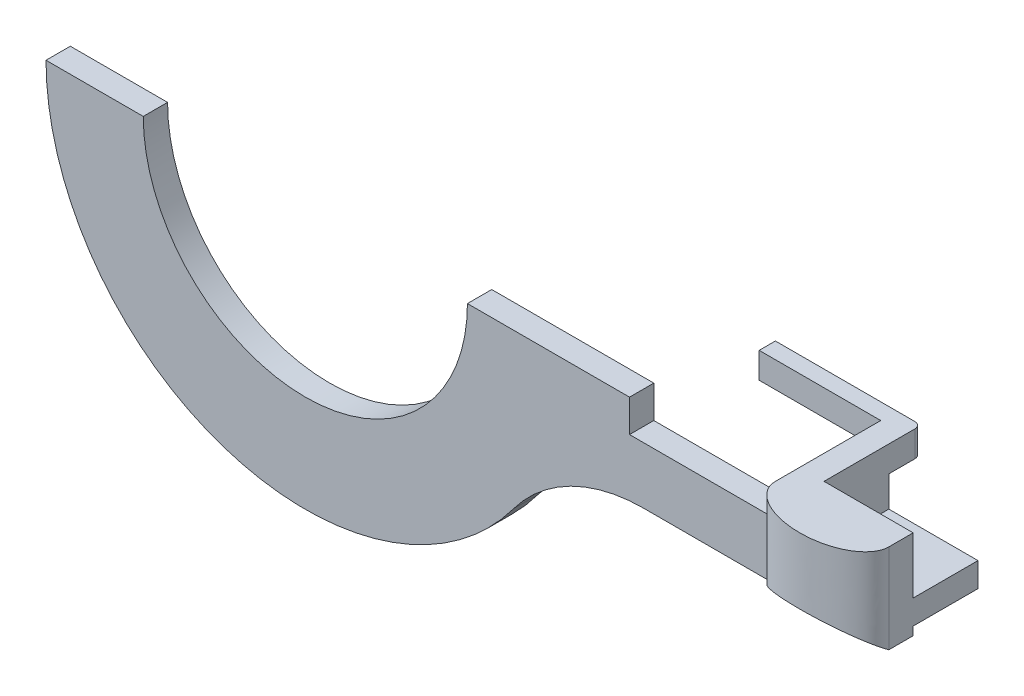
ISO-10303-21;
HEADER;
FILE_DESCRIPTION(('STEP AP214'),'2;1');
FILE_NAME('part.step','',(''),(''),'','','');
FILE_SCHEMA(('AUTOMOTIVE_DESIGN { 1 0 10303 214 1 1 1 1 }'));
ENDSEC;
DATA;
#1=APPLICATION_CONTEXT('core data for automotive mechanical design processes');
#2=APPLICATION_PROTOCOL_DEFINITION('international standard','automotive_design',2000,#1);
#3=PRODUCT_CONTEXT('',#1,'mechanical');
#4=PRODUCT('Part','Part','',(#3));
#5=PRODUCT_RELATED_PRODUCT_CATEGORY('part','',(#4));
#6=PRODUCT_DEFINITION_FORMATION('','',#4);
#7=PRODUCT_DEFINITION_CONTEXT('part definition',#1,'design');
#8=PRODUCT_DEFINITION('design','',#6,#7);
#9=PRODUCT_DEFINITION_SHAPE('','',#8);
#10=(LENGTH_UNIT() NAMED_UNIT(*) SI_UNIT(.MILLI.,.METRE.));
#11=(NAMED_UNIT(*) PLANE_ANGLE_UNIT() SI_UNIT($,.RADIAN.));
#12=(NAMED_UNIT(*) SI_UNIT($,.STERADIAN.) SOLID_ANGLE_UNIT());
#13=UNCERTAINTY_MEASURE_WITH_UNIT(LENGTH_MEASURE(1.E-05),#10,'distance_accuracy_value','');
#14=(GEOMETRIC_REPRESENTATION_CONTEXT(3) GLOBAL_UNCERTAINTY_ASSIGNED_CONTEXT((#13)) GLOBAL_UNIT_ASSIGNED_CONTEXT((#10,
#11,#12)) REPRESENTATION_CONTEXT('',''));
#15=CARTESIAN_POINT('',(0.,0.,0.));
#16=DIRECTION('',(0.,0.,1.));
#17=DIRECTION('',(1.,0.,0.));
#18=AXIS2_PLACEMENT_3D('',#15,#16,#17);
#19=CARTESIAN_POINT('',(14.5,2.50874087860968,-2.));
#20=DIRECTION('',(0.,0.,1.));
#21=DIRECTION('',(1.,0.,0.));
#22=AXIS2_PLACEMENT_3D('',#19,#20,#21);
#23=PLANE('',#22);
#24=DIRECTION('',(-1.,0.,0.));
#25=VECTOR('',#24,1.);
#26=CARTESIAN_POINT('',(15.25,-0.8,-2.));
#27=LINE('',#26,#25);
#28=CARTESIAN_POINT('',(15.25,-0.8,-2.));
#29=VERTEX_POINT('',#28);
#30=CARTESIAN_POINT('',(14.5,-0.8,-2.));
#31=VERTEX_POINT('',#30);
#32=EDGE_CURVE('E224',#29,#31,#27,.T.);
#33=ORIENTED_EDGE('',*,*,#32,.F.);
#34=DIRECTION('',(0.,-1.,0.));
#35=VECTOR('',#34,1.);
#36=CARTESIAN_POINT('',(15.25,-1.74125912139032,-2.));
#37=LINE('',#36,#35);
#38=CARTESIAN_POINT('',(15.25,-1.74125912139032,-2.));
#39=VERTEX_POINT('',#38);
#40=EDGE_CURVE('E253',#29,#39,#37,.T.);
#41=ORIENTED_EDGE('',*,*,#40,.T.);
#42=DIRECTION('',(1.,0.,0.));
#43=VECTOR('',#42,1.);
#44=CARTESIAN_POINT('',(18.,-1.74125912139032,-2.));
#45=LINE('',#44,#43);
#46=CARTESIAN_POINT('',(18.,-1.74125912139032,-2.));
#47=VERTEX_POINT('',#46);
#48=EDGE_CURVE('E255',#39,#47,#45,.T.);
#49=ORIENTED_EDGE('',*,*,#48,.T.);
#50=DIRECTION('',(0.,-1.,0.));
#51=VECTOR('',#50,1.);
#52=CARTESIAN_POINT('',(18.,-2.49125912139032,-2.));
#53=LINE('',#52,#51);
#54=CARTESIAN_POINT('',(18.,-2.49125912139032,-2.));
#55=VERTEX_POINT('',#54);
#56=EDGE_CURVE('E259',#47,#55,#53,.T.);
#57=ORIENTED_EDGE('',*,*,#56,.T.);
#58=DIRECTION('',(-1.,0.,0.));
#59=VECTOR('',#58,1.);
#60=CARTESIAN_POINT('',(18.,-2.49125912139032,-2.));
#61=LINE('',#60,#59);
#62=CARTESIAN_POINT('',(14.5,-2.49125912139032,-2.));
#63=VERTEX_POINT('',#62);
#64=EDGE_CURVE('E261',#55,#63,#61,.T.);
#65=ORIENTED_EDGE('',*,*,#64,.T.);
#66=DIRECTION('',(0.,1.,0.));
#67=VECTOR('',#66,1.);
#68=CARTESIAN_POINT('',(14.5,-2.49125912139032,-2.));
#69=LINE('',#68,#67);
#70=EDGE_CURVE('E251',#63,#31,#69,.T.);
#71=ORIENTED_EDGE('',*,*,#70,.T.);
#72=EDGE_LOOP('',(#33,#41,#49,#57,#65,#71));
#73=FACE_BOUND('',#72,.T.);
#74=ADVANCED_FACE('F35',(#73),#23,.F.);
#75=CARTESIAN_POINT('',(10.4373128725741,7.75,0.));
#76=DIRECTION('',(0.,0.,1.));
#77=DIRECTION('',(1.,0.,0.));
#78=AXIS2_PLACEMENT_3D('',#75,#76,#77);
#79=PLANE('',#78);
#80=CARTESIAN_POINT('',(0.,0.,0.));
#81=DIRECTION('',(0.,0.,1.));
#82=DIRECTION('',(1.,0.,0.));
#83=AXIS2_PLACEMENT_3D('',#80,#81,#82);
#84=CIRCLE('',#83,8.);
#85=CARTESIAN_POINT('',(-8.,0.,0.));
#86=VERTEX_POINT('',#85);
#87=CARTESIAN_POINT('',(6.42296176773788,-4.76923076923077,0.));
#88=VERTEX_POINT('',#87);
#89=EDGE_CURVE('E349',#86,#88,#84,.T.);
#90=ORIENTED_EDGE('',*,*,#89,.F.);
#91=DIRECTION('',(1.,0.,0.));
#92=VECTOR('',#91,1.);
#93=CARTESIAN_POINT('',(10.4373128725741,0.,0.));
#94=LINE('',#93,#92);
#95=CARTESIAN_POINT('',(-5.,0.,0.));
#96=VERTEX_POINT('',#95);
#97=EDGE_CURVE('E398',#86,#96,#94,.T.);
#98=ORIENTED_EDGE('',*,*,#97,.T.);
#99=CARTESIAN_POINT('',(0.,0.,0.));
#100=DIRECTION('',(0.,0.,1.));
#101=DIRECTION('',(1.,0.,0.));
#102=AXIS2_PLACEMENT_3D('',#99,#100,#101);
#103=CIRCLE('',#102,5.);
#104=CARTESIAN_POINT('',(5.,0.,0.));
#105=VERTEX_POINT('',#104);
#106=EDGE_CURVE('E355',#96,#105,#103,.T.);
#107=ORIENTED_EDGE('',*,*,#106,.T.);
#108=CARTESIAN_POINT('',(10.,0.,0.));
#109=VERTEX_POINT('',#108);
#110=EDGE_CURVE('E389',#105,#109,#94,.T.);
#111=ORIENTED_EDGE('',*,*,#110,.T.);
#112=DIRECTION('',(0.,-1.,0.));
#113=VECTOR('',#112,1.);
#114=CARTESIAN_POINT('',(10.,1.,0.));
#115=LINE('',#114,#113);
#116=CARTESIAN_POINT('',(10.,-1.,0.));
#117=VERTEX_POINT('',#116);
#118=EDGE_CURVE('E290',#109,#117,#115,.T.);
#119=ORIENTED_EDGE('',*,*,#118,.T.);
#120=DIRECTION('',(1.,0.,0.));
#121=VECTOR('',#120,1.);
#122=CARTESIAN_POINT('',(10.,-1.,0.));
#123=LINE('',#122,#121);
#124=CARTESIAN_POINT('',(14.5,-1.,0.));
#125=VERTEX_POINT('',#124);
#126=EDGE_CURVE('E286',#117,#125,#123,.T.);
#127=ORIENTED_EDGE('',*,*,#126,.T.);
#128=DIRECTION('',(0.,1.,0.));
#129=VECTOR('',#128,1.);
#130=CARTESIAN_POINT('',(14.5,-2.49125912139032,0.));
#131=LINE('',#130,#129);
#132=CARTESIAN_POINT('',(14.5,-2.49125912139032,0.));
#133=VERTEX_POINT('',#132);
#134=EDGE_CURVE('E215',#133,#125,#131,.T.);
#135=ORIENTED_EDGE('',*,*,#134,.F.);
#136=DIRECTION('',(-1.,0.,0.));
#137=VECTOR('',#136,1.);
#138=CARTESIAN_POINT('',(18.,-2.49125912139032,0.));
#139=LINE('',#138,#137);
#140=CARTESIAN_POINT('',(18.,-2.49125912139032,0.));
#141=VERTEX_POINT('',#140);
#142=EDGE_CURVE('E241',#141,#133,#139,.T.);
#143=ORIENTED_EDGE('',*,*,#142,.F.);
#144=DIRECTION('',(0.,1.,0.));
#145=VECTOR('',#144,1.);
#146=CARTESIAN_POINT('',(18.,2.75,0.));
#147=LINE('',#146,#145);
#148=CARTESIAN_POINT('',(18.,-2.75,0.));
#149=VERTEX_POINT('',#148);
#150=EDGE_CURVE('E309',#149,#141,#147,.T.);
#151=ORIENTED_EDGE('',*,*,#150,.F.);
#152=DIRECTION('',(1.,0.,0.));
#153=VECTOR('',#152,1.);
#154=CARTESIAN_POINT('',(10.4373128725741,-2.75,0.));
#155=LINE('',#154,#153);
#156=CARTESIAN_POINT('',(10.4373128725741,-2.75,0.));
#157=VERTEX_POINT('',#156);
#158=EDGE_CURVE('E318',#157,#149,#155,.T.);
#159=ORIENTED_EDGE('',*,*,#158,.F.);
#160=CARTESIAN_POINT('',(10.4373128725741,-7.75,0.));
#161=DIRECTION('',(0.,0.,-1.));
#162=DIRECTION('',(-1.,0.,0.));
#163=AXIS2_PLACEMENT_3D('',#160,#161,#162);
#164=CIRCLE('',#163,5.);
#165=EDGE_CURVE('E343',#88,#157,#164,.T.);
#166=ORIENTED_EDGE('',*,*,#165,.F.);
#167=EDGE_LOOP('',(#90,#98,#107,#111,#119,#127,#135,#143,#151,#159,#166));
#168=FACE_BOUND('',#167,.T.);
#169=ADVANCED_FACE('F347',(#168),#79,.F.);
#170=DIRECTION('',(0.,-1.,0.));
#171=VECTOR('',#170,1.);
#172=CARTESIAN_POINT('',(15.25,-1.74125912139032,0.));
#173=LINE('',#172,#171);
#174=CARTESIAN_POINT('',(15.25,0.,0.));
#175=VERTEX_POINT('',#174);
#176=CARTESIAN_POINT('',(15.25,-1.74125912139032,0.));
#177=VERTEX_POINT('',#176);
#178=EDGE_CURVE('E230',#175,#177,#173,.T.);
#179=ORIENTED_EDGE('',*,*,#178,.F.);
#180=DIRECTION('',(1.,0.,0.));
#181=VECTOR('',#180,1.);
#182=CARTESIAN_POINT('',(10.4373128725741,0.,0.));
#183=LINE('',#182,#181);
#184=CARTESIAN_POINT('',(18.,0.,0.));
#185=VERTEX_POINT('',#184);
#186=EDGE_CURVE('E444',#175,#185,#183,.T.);
#187=ORIENTED_EDGE('',*,*,#186,.T.);
#188=CARTESIAN_POINT('',(18.,-1.74125912139032,0.));
#189=VERTEX_POINT('',#188);
#190=EDGE_CURVE('E277',#189,#185,#147,.T.);
#191=ORIENTED_EDGE('',*,*,#190,.F.);
#192=DIRECTION('',(1.,0.,0.));
#193=VECTOR('',#192,1.);
#194=CARTESIAN_POINT('',(18.,-1.74125912139032,0.));
#195=LINE('',#194,#193);
#196=EDGE_CURVE('E232',#177,#189,#195,.T.);
#197=ORIENTED_EDGE('',*,*,#196,.F.);
#198=EDGE_LOOP('',(#179,#187,#191,#197));
#199=FACE_BOUND('',#198,.T.);
#200=ADVANCED_FACE('F468',(#199),#79,.F.);
#201=CARTESIAN_POINT('',(10.4373128725741,7.75,0.75));
#202=DIRECTION('',(0.,0.,1.));
#203=DIRECTION('',(1.,0.,0.));
#204=AXIS2_PLACEMENT_3D('',#201,#202,#203);
#205=PLANE('',#204);
#206=DIRECTION('',(1.,0.,0.));
#207=VECTOR('',#206,1.);
#208=CARTESIAN_POINT('',(10.4373128725741,0.,0.75));
#209=LINE('',#208,#207);
#210=CARTESIAN_POINT('',(-8.,0.,0.75));
#211=VERTEX_POINT('',#210);
#212=CARTESIAN_POINT('',(-5.,0.,0.75));
#213=VERTEX_POINT('',#212);
#214=EDGE_CURVE('E50',#211,#213,#209,.T.);
#215=ORIENTED_EDGE('',*,*,#214,.F.);
#216=CARTESIAN_POINT('',(0.,0.,0.75));
#217=DIRECTION('',(0.,0.,1.));
#218=DIRECTION('',(1.,0.,0.));
#219=AXIS2_PLACEMENT_3D('',#216,#217,#218);
#220=CIRCLE('',#219,8.);
#221=CARTESIAN_POINT('',(6.42296176773788,-4.76923076923077,0.75));
#222=VERTEX_POINT('',#221);
#223=EDGE_CURVE('E315',#211,#222,#220,.T.);
#224=ORIENTED_EDGE('',*,*,#223,.T.);
#225=CARTESIAN_POINT('',(10.4373128725741,-7.75,0.75));
#226=DIRECTION('',(0.,0.,-1.));
#227=DIRECTION('',(-1.,0.,0.));
#228=AXIS2_PLACEMENT_3D('',#225,#226,#227);
#229=CIRCLE('',#228,5.);
#230=CARTESIAN_POINT('',(10.4373128725741,-2.75,0.75));
#231=VERTEX_POINT('',#230);
#232=EDGE_CURVE('E316',#222,#231,#229,.T.);
#233=ORIENTED_EDGE('',*,*,#232,.T.);
#234=DIRECTION('',(1.,0.,0.));
#235=VECTOR('',#234,1.);
#236=CARTESIAN_POINT('',(10.4373128725741,-2.75,0.75));
#237=LINE('',#236,#235);
#238=CARTESIAN_POINT('',(14.5,-2.75,0.75));
#239=VERTEX_POINT('',#238);
#240=EDGE_CURVE('E327',#231,#239,#237,.T.);
#241=ORIENTED_EDGE('',*,*,#240,.T.);
#242=DIRECTION('',(0.,1.,0.));
#243=VECTOR('',#242,1.);
#244=CARTESIAN_POINT('',(14.5,-2.75,0.75));
#245=LINE('',#244,#243);
#246=CARTESIAN_POINT('',(14.5,-1.,0.75));
#247=VERTEX_POINT('',#246);
#248=EDGE_CURVE('E268',#239,#247,#245,.T.);
#249=ORIENTED_EDGE('',*,*,#248,.T.);
#250=DIRECTION('',(1.,0.,0.));
#251=VECTOR('',#250,1.);
#252=CARTESIAN_POINT('',(10.,-1.,0.75));
#253=LINE('',#252,#251);
#254=CARTESIAN_POINT('',(10.,-1.,0.75));
#255=VERTEX_POINT('',#254);
#256=EDGE_CURVE('E362',#255,#247,#253,.T.);
#257=ORIENTED_EDGE('',*,*,#256,.F.);
#258=DIRECTION('',(0.,-1.,0.));
#259=VECTOR('',#258,1.);
#260=CARTESIAN_POINT('',(10.,1.,0.75));
#261=LINE('',#260,#259);
#262=CARTESIAN_POINT('',(10.,0.,0.75));
#263=VERTEX_POINT('',#262);
#264=EDGE_CURVE('E289',#263,#255,#261,.T.);
#265=ORIENTED_EDGE('',*,*,#264,.F.);
#266=CARTESIAN_POINT('',(5.,0.,0.75));
#267=VERTEX_POINT('',#266);
#268=EDGE_CURVE('E58',#267,#263,#209,.T.);
#269=ORIENTED_EDGE('',*,*,#268,.F.);
#270=CARTESIAN_POINT('',(0.,0.,0.75));
#271=DIRECTION('',(0.,0.,1.));
#272=DIRECTION('',(1.,0.,0.));
#273=AXIS2_PLACEMENT_3D('',#270,#271,#272);
#274=CIRCLE('',#273,5.);
#275=EDGE_CURVE('E350',#213,#267,#274,.T.);
#276=ORIENTED_EDGE('',*,*,#275,.F.);
#277=EDGE_LOOP('',(#215,#224,#233,#241,#249,#257,#265,#269,#276));
#278=FACE_BOUND('',#277,.T.);
#279=ADVANCED_FACE('F370',(#278),#205,.T.);
#280=CARTESIAN_POINT('',(0.,0.,0.75));
#281=DIRECTION('',(0.,0.,-1.));
#282=DIRECTION('',(-1.,0.,0.));
#283=AXIS2_PLACEMENT_3D('',#280,#281,#282);
#284=CYLINDRICAL_SURFACE('',#283,8.);
#285=ORIENTED_EDGE('',*,*,#223,.F.);
#286=DIRECTION('',(0.,0.,-1.));
#287=VECTOR('',#286,1.);
#288=CARTESIAN_POINT('',(-8.,0.,0.75));
#289=LINE('',#288,#287);
#290=EDGE_CURVE('E402',#211,#86,#289,.T.);
#291=ORIENTED_EDGE('',*,*,#290,.T.);
#292=ORIENTED_EDGE('',*,*,#89,.T.);
#293=DIRECTION('',(0.,0.,-1.));
#294=VECTOR('',#293,1.);
#295=CARTESIAN_POINT('',(6.42296176773788,-4.76923076923077,0.75));
#296=LINE('',#295,#294);
#297=EDGE_CURVE('E204',#222,#88,#296,.T.);
#298=ORIENTED_EDGE('',*,*,#297,.F.);
#299=EDGE_LOOP('',(#285,#291,#292,#298));
#300=FACE_BOUND('',#299,.T.);
#301=ADVANCED_FACE('F37',(#300),#284,.T.);
#302=CARTESIAN_POINT('',(10.4373128725741,-7.75,0.75));
#303=DIRECTION('',(0.,0.,-1.));
#304=DIRECTION('',(-1.,0.,0.));
#305=AXIS2_PLACEMENT_3D('',#302,#303,#304);
#306=CYLINDRICAL_SURFACE('',#305,5.);
#307=ORIENTED_EDGE('',*,*,#165,.T.);
#308=DIRECTION('',(0.,0.,-1.));
#309=VECTOR('',#308,1.);
#310=CARTESIAN_POINT('',(10.4373128725741,-2.75,0.75));
#311=LINE('',#310,#309);
#312=EDGE_CURVE('E332',#231,#157,#311,.T.);
#313=ORIENTED_EDGE('',*,*,#312,.F.);
#314=ORIENTED_EDGE('',*,*,#232,.F.);
#315=ORIENTED_EDGE('',*,*,#297,.T.);
#316=EDGE_LOOP('',(#307,#313,#314,#315));
#317=FACE_BOUND('',#316,.T.);
#318=ADVANCED_FACE('F342',(#317),#306,.F.);
#319=CARTESIAN_POINT('',(10.4373128725741,-2.75,0.75));
#320=DIRECTION('',(0.,1.,0.));
#321=DIRECTION('',(-1.,0.,0.));
#322=AXIS2_PLACEMENT_3D('',#319,#320,#321);
#323=PLANE('',#322);
#324=DIRECTION('',(0.,0.,-1.));
#325=VECTOR('',#324,1.);
#326=CARTESIAN_POINT('',(18.,-2.75,0.75));
#327=LINE('',#326,#325);
#328=CARTESIAN_POINT('',(18.,-2.75,0.75));
#329=VERTEX_POINT('',#328);
#330=EDGE_CURVE('E312',#329,#149,#327,.T.);
#331=ORIENTED_EDGE('',*,*,#330,.F.);
#332=DIRECTION('',(1.,0.,0.));
#333=VECTOR('',#332,1.);
#334=CARTESIAN_POINT('',(13.,-2.75,0.75));
#335=LINE('',#334,#333);
#336=EDGE_CURVE('E405',#239,#329,#335,.T.);
#337=ORIENTED_EDGE('',*,*,#336,.F.);
#338=ORIENTED_EDGE('',*,*,#240,.F.);
#339=ORIENTED_EDGE('',*,*,#312,.T.);
#340=ORIENTED_EDGE('',*,*,#158,.T.);
#341=EDGE_LOOP('',(#331,#337,#338,#339,#340));
#342=FACE_BOUND('',#341,.T.);
#343=ADVANCED_FACE('F435',(#342),#323,.F.);
#344=CARTESIAN_POINT('',(18.,2.75,0.75));
#345=DIRECTION('',(-1.,0.,0.));
#346=DIRECTION('',(0.,0.,1.));
#347=AXIS2_PLACEMENT_3D('',#344,#345,#346);
#348=PLANE('',#347);
#349=ORIENTED_EDGE('',*,*,#190,.T.);
#350=DIRECTION('',(0.,0.,1.));
#351=VECTOR('',#350,1.);
#352=CARTESIAN_POINT('',(18.,0.,0.75));
#353=LINE('',#352,#351);
#354=CARTESIAN_POINT('',(18.,0.,0.75));
#355=VERTEX_POINT('',#354);
#356=EDGE_CURVE('E442',#185,#355,#353,.T.);
#357=ORIENTED_EDGE('',*,*,#356,.T.);
#358=DIRECTION('',(0.,1.,0.));
#359=VECTOR('',#358,1.);
#360=CARTESIAN_POINT('',(18.,2.75,0.75));
#361=LINE('',#360,#359);
#362=EDGE_CURVE('E329',#329,#355,#361,.T.);
#363=ORIENTED_EDGE('',*,*,#362,.F.);
#364=ORIENTED_EDGE('',*,*,#330,.T.);
#365=ORIENTED_EDGE('',*,*,#150,.T.);
#366=DIRECTION('',(0.,0.,1.));
#367=VECTOR('',#366,1.);
#368=CARTESIAN_POINT('',(18.,-2.49125912139032,-2.));
#369=LINE('',#368,#367);
#370=EDGE_CURVE('E248',#55,#141,#369,.T.);
#371=ORIENTED_EDGE('',*,*,#370,.F.);
#372=ORIENTED_EDGE('',*,*,#56,.F.);
#373=DIRECTION('',(0.,0.,1.));
#374=VECTOR('',#373,1.);
#375=CARTESIAN_POINT('',(18.,-1.74125912139032,-2.));
#376=LINE('',#375,#374);
#377=EDGE_CURVE('E244',#47,#189,#376,.T.);
#378=ORIENTED_EDGE('',*,*,#377,.T.);
#379=EDGE_LOOP('',(#349,#357,#363,#364,#365,#371,#372,#378));
#380=FACE_BOUND('',#379,.T.);
#381=ADVANCED_FACE('F306',(#380),#348,.F.);
#382=CARTESIAN_POINT('',(0.,0.,0.75));
#383=DIRECTION('',(0.,0.,-1.));
#384=DIRECTION('',(-1.,0.,0.));
#385=AXIS2_PLACEMENT_3D('',#382,#383,#384);
#386=CYLINDRICAL_SURFACE('',#385,5.);
#387=DIRECTION('',(0.,0.,-1.));
#388=VECTOR('',#387,1.);
#389=CARTESIAN_POINT('',(-5.,0.,0.75));
#390=LINE('',#389,#388);
#391=EDGE_CURVE('E396',#213,#96,#390,.T.);
#392=ORIENTED_EDGE('',*,*,#391,.F.);
#393=ORIENTED_EDGE('',*,*,#275,.T.);
#394=DIRECTION('',(0.,0.,-1.));
#395=VECTOR('',#394,1.);
#396=CARTESIAN_POINT('',(5.,0.,0.75));
#397=LINE('',#396,#395);
#398=EDGE_CURVE('E395',#105,#267,#397,.F.);
#399=ORIENTED_EDGE('',*,*,#398,.F.);
#400=ORIENTED_EDGE('',*,*,#106,.F.);
#401=EDGE_LOOP('',(#392,#393,#399,#400));
#402=FACE_BOUND('',#401,.T.);
#403=ADVANCED_FACE('F393',(#402),#386,.F.);
#404=CARTESIAN_POINT('',(10.,1.,0.75));
#405=DIRECTION('',(1.,0.,0.));
#406=DIRECTION('',(0.,0.,-1.));
#407=AXIS2_PLACEMENT_3D('',#404,#405,#406);
#408=PLANE('',#407);
#409=DIRECTION('',(0.,0.,-1.));
#410=VECTOR('',#409,1.);
#411=CARTESIAN_POINT('',(10.,0.,0.75));
#412=LINE('',#411,#410);
#413=EDGE_CURVE('E387',#263,#109,#412,.T.);
#414=ORIENTED_EDGE('',*,*,#413,.F.);
#415=ORIENTED_EDGE('',*,*,#264,.T.);
#416=DIRECTION('',(0.,0.,-1.));
#417=VECTOR('',#416,1.);
#418=CARTESIAN_POINT('',(10.,-1.,0.75));
#419=LINE('',#418,#417);
#420=EDGE_CURVE('E282',#255,#117,#419,.T.);
#421=ORIENTED_EDGE('',*,*,#420,.T.);
#422=ORIENTED_EDGE('',*,*,#118,.F.);
#423=EDGE_LOOP('',(#414,#415,#421,#422));
#424=FACE_BOUND('',#423,.T.);
#425=ADVANCED_FACE('F386',(#424),#408,.T.);
#426=CARTESIAN_POINT('',(10.,-1.,0.75));
#427=DIRECTION('',(0.,1.,0.));
#428=DIRECTION('',(-1.,0.,0.));
#429=AXIS2_PLACEMENT_3D('',#426,#427,#428);
#430=PLANE('',#429);
#431=ORIENTED_EDGE('',*,*,#126,.F.);
#432=ORIENTED_EDGE('',*,*,#420,.F.);
#433=ORIENTED_EDGE('',*,*,#256,.T.);
#434=DIRECTION('',(0.,0.,-1.));
#435=VECTOR('',#434,1.);
#436=CARTESIAN_POINT('',(14.5,-1.,0.75));
#437=LINE('',#436,#435);
#438=EDGE_CURVE('E280',#247,#125,#437,.T.);
#439=ORIENTED_EDGE('',*,*,#438,.T.);
#440=EDGE_LOOP('',(#431,#432,#433,#439));
#441=FACE_BOUND('',#440,.T.);
#442=ADVANCED_FACE('F378',(#441),#430,.T.);
#443=CARTESIAN_POINT('',(14.5,1.,0.75));
#444=DIRECTION('',(-1.,0.,0.));
#445=DIRECTION('',(0.,0.,1.));
#446=AXIS2_PLACEMENT_3D('',#443,#444,#445);
#447=PLANE('',#446);
#448=DIRECTION('',(0.,0.,1.));
#449=VECTOR('',#448,1.);
#450=CARTESIAN_POINT('',(14.5,0.,0.75));
#451=LINE('',#450,#449);
#452=CARTESIAN_POINT('',(14.5,0.,-2.5));
#453=VERTEX_POINT('',#452);
#454=CARTESIAN_POINT('',(14.5,0.,0.75));
#455=VERTEX_POINT('',#454);
#456=EDGE_CURVE('E430',#453,#455,#451,.T.);
#457=ORIENTED_EDGE('',*,*,#456,.F.);
#458=DIRECTION('',(0.,1.,0.));
#459=VECTOR('',#458,1.);
#460=CARTESIAN_POINT('',(14.5,-0.8,-2.5));
#461=LINE('',#460,#459);
#462=CARTESIAN_POINT('',(14.5,-0.8,-2.5));
#463=VERTEX_POINT('',#462);
#464=EDGE_CURVE('E221',#463,#453,#461,.T.);
#465=ORIENTED_EDGE('',*,*,#464,.F.);
#466=DIRECTION('',(0.,0.,1.));
#467=VECTOR('',#466,1.);
#468=CARTESIAN_POINT('',(14.5,-0.8,-2.5));
#469=LINE('',#468,#467);
#470=EDGE_CURVE('E216',#463,#31,#469,.T.);
#471=ORIENTED_EDGE('',*,*,#470,.T.);
#472=ORIENTED_EDGE('',*,*,#70,.F.);
#473=DIRECTION('',(0.,0.,1.));
#474=VECTOR('',#473,1.);
#475=CARTESIAN_POINT('',(14.5,-2.49125912139032,-2.));
#476=LINE('',#475,#474);
#477=EDGE_CURVE('E263',#63,#133,#476,.T.);
#478=ORIENTED_EDGE('',*,*,#477,.T.);
#479=ORIENTED_EDGE('',*,*,#134,.T.);
#480=ORIENTED_EDGE('',*,*,#438,.F.);
#481=DIRECTION('',(0.,1.,0.));
#482=VECTOR('',#481,1.);
#483=CARTESIAN_POINT('',(14.5,1.,0.75));
#484=LINE('',#483,#482);
#485=EDGE_CURVE('E283',#247,#455,#484,.T.);
#486=ORIENTED_EDGE('',*,*,#485,.T.);
#487=EDGE_LOOP('',(#457,#465,#471,#472,#478,#479,#480,#486));
#488=FACE_BOUND('',#487,.T.);
#489=ADVANCED_FACE('F381',(#488),#447,.T.);
#490=CARTESIAN_POINT('',(16.25,-2.75,0.75));
#491=DIRECTION('',(0.,1.,0.));
#492=DIRECTION('',(1.,0.,0.));
#493=AXIS2_PLACEMENT_3D('',#490,#491,#492);
#494=ELLIPSE('',#493,1.75,1.);
#495=DIRECTION('',(0.,1.,0.));
#496=VECTOR('',#495,1.);
#497=SURFACE_OF_LINEAR_EXTRUSION('',#494,#496);
#498=CARTESIAN_POINT('',(16.25,0.,0.75));
#499=DIRECTION('',(0.,1.,0.));
#500=DIRECTION('',(1.,0.,0.));
#501=AXIS2_PLACEMENT_3D('',#498,#499,#500);
#502=ELLIPSE('',#501,1.75,1.);
#503=EDGE_CURVE('E440',#455,#355,#502,.T.);
#504=ORIENTED_EDGE('',*,*,#503,.F.);
#505=ORIENTED_EDGE('',*,*,#485,.F.);
#506=ORIENTED_EDGE('',*,*,#248,.F.);
#507=CARTESIAN_POINT('',(18.,-2.75,0.75));
#508=CARTESIAN_POINT('',(18.0000032040235,-2.73586960670656,0.769810073362587));
#509=CARTESIAN_POINT('',(17.9989690571978,-2.72174608992089,0.789610506220453));
#510=CARTESIAN_POINT('',(17.9948642261136,-2.69360628804617,0.829061038698257));
#511=CARTESIAN_POINT('',(17.9917945838643,-2.67958995180102,0.848711210036392));
#512=CARTESIAN_POINT('',(17.9796368864724,-2.63798738739735,0.907035832415519));
#513=CARTESIAN_POINT('',(17.9675990514151,-2.6106758169573,0.945325227680664));
#514=CARTESIAN_POINT('',(17.9360088334206,-2.55682539671048,1.02082070424261));
#515=CARTESIAN_POINT('',(17.9162751568887,-2.53032323020283,1.05797535747003));
#516=CARTESIAN_POINT('',(17.8704025275153,-2.47924694233857,1.12958164532541));
#517=CARTESIAN_POINT('',(17.8442580842507,-2.45467449761158,1.16403092940622));
#518=CARTESIAN_POINT('',(17.794626050457,-2.41418075163822,1.22080104626006));
#519=CARTESIAN_POINT('',(17.7723797869221,-2.3977365173172,1.24385500389074));
#520=CARTESIAN_POINT('',(17.7255266664397,-2.36604084964486,1.28829067449269));
#521=CARTESIAN_POINT('',(17.7009206960119,-2.35078897221502,1.30967301003886));
#522=CARTESIAN_POINT('',(17.6236688351291,-2.30658991854634,1.37163777475191));
#523=CARTESIAN_POINT('',(17.5679136785683,-2.27945611414412,1.40967795131716));
#524=CARTESIAN_POINT('',(17.4505384512127,-2.22987558424505,1.47918726462952));
#525=CARTESIAN_POINT('',(17.3889093780482,-2.20743622722446,1.51064607115777));
#526=CARTESIAN_POINT('',(17.2491663940314,-2.16308282853773,1.57282721952466));
#527=CARTESIAN_POINT('',(17.1701692454099,-2.14210942313912,1.60223083844594));
#528=CARTESIAN_POINT('',(17.0084118764454,-2.10607478510562,1.65274951886864));
#529=CARTESIAN_POINT('',(16.9256535805273,-2.09101056615172,1.67386876703333));
#530=CARTESIAN_POINT('',(16.7122542004266,-2.05975942375149,1.71768123642173));
#531=CARTESIAN_POINT('',(16.5799301098358,-2.04737405543476,1.73504487591001));
#532=CARTESIAN_POINT('',(16.3137440991529,-2.03509214268538,1.75226347609675));
#533=CARTESIAN_POINT('',(16.1798827625775,-2.03519100651806,1.7521248741674));
#534=CARTESIAN_POINT('',(15.9151209928888,-2.04780507709691,1.73444060605172));
#535=CARTESIAN_POINT('',(15.7842044614596,-2.06020074738805,1.71706252373194));
#536=CARTESIAN_POINT('',(15.5425633196284,-2.09573477153233,1.66724567783493));
#537=CARTESIAN_POINT('',(15.4312405737858,-2.11748407025812,1.63675429699515));
#538=CARTESIAN_POINT('',(15.2328522038806,-2.16791923266344,1.56604683354772));
#539=CARTESIAN_POINT('',(15.1446589764773,-2.19506618056125,1.5279882304882));
#540=CARTESIAN_POINT('',(15.0263856331882,-2.23968538514297,1.46543443613941));
#541=CARTESIAN_POINT('',(14.9922989770938,-2.25362150141868,1.44589672900855));
#542=CARTESIAN_POINT('',(14.9261338544206,-2.28307847363232,1.4045995925118));
#543=CARTESIAN_POINT('',(14.8940585062799,-2.29860169685301,1.38283684433913));
#544=CARTESIAN_POINT('',(14.8102475578318,-2.34298348380317,1.32061589710946));
#545=CARTESIAN_POINT('',(14.7609180903715,-2.37341877861429,1.27794720342913));
#546=CARTESIAN_POINT('',(14.6725013776049,-2.43895254998432,1.18607227881749));
#547=CARTESIAN_POINT('',(14.6333926606401,-2.47404101343199,1.13688008574515));
#548=CARTESIAN_POINT('',(14.5778564864521,-2.53771863659293,1.04760738397547));
#549=CARTESIAN_POINT('',(14.558142681175,-2.56534329208093,1.00887905982558));
#550=CARTESIAN_POINT('',(14.5269018098371,-2.62208622682746,0.929328429011975));
#551=CARTESIAN_POINT('',(14.5153548014377,-2.65120068025455,0.888511485964101));
#552=CARTESIAN_POINT('',(14.5055359599904,-2.6921345239932,0.831124375029834));
#553=CARTESIAN_POINT('',(14.503462673206,-2.7036757886436,0.814944124793788));
#554=CARTESIAN_POINT('',(14.5006950246235,-2.72680952040525,0.782511841145918));
#555=CARTESIAN_POINT('',(14.5000001433151,-2.73840196657498,0.766259837093004));
#556=CARTESIAN_POINT('',(14.5,-2.75,0.75));
#557=B_SPLINE_CURVE_WITH_KNOTS('',3,(#507,#508,#509,#510,#511,#512,#513,#514,#515,#516,#517,
#518,#519,#520,#521,#522,#523,#524,#525,#526,#527,#528,#529,#530,#531,#532,#533,#534,#535,#536,
#537,#538,#539,#540,#541,#542,#543,#544,#545,#546,#547,#548,#549,#550,#551,#552,#553,#554,#555,
#556),.UNSPECIFIED.,.F.,.F.,(4,2,2,2,2,2,2,2,2,2,2,2,2,2,2,2,2,2,2,2,2,2,2,2,4),(0.,
0.0729551422631139,0.145872966188331,0.290832301421717,0.439435620800619,0.588166656946255,
0.696062851723336,0.803918668543823,1.02125585178241,1.2389316528981,1.49869953168799,
1.75833596221891,2.15843446294904,2.55838580678677,2.95448697494383,3.30533644207124,
3.60332230307633,3.72826854227916,3.85340394451769,4.06832292570442,4.28278671019864,
4.4366599880951,4.59015621636546,4.65006502883619,4.70995125784565),.UNSPECIFIED.);
#558=EDGE_CURVE('E200',#329,#239,#557,.T.);
#559=ORIENTED_EDGE('',*,*,#558,.F.);
#560=ORIENTED_EDGE('',*,*,#362,.T.);
#561=EDGE_LOOP('',(#504,#505,#506,#559,#560));
#562=FACE_BOUND('',#561,.T.);
#563=ADVANCED_FACE('F439',(#562),#497,.T.);
#564=CARTESIAN_POINT('',(15.25,-1.74125912139032,-2.));
#565=DIRECTION('',(-1.,0.,0.));
#566=DIRECTION('',(0.,0.,1.));
#567=AXIS2_PLACEMENT_3D('',#564,#565,#566);
#568=PLANE('',#567);
#569=DIRECTION('',(0.,-1.,0.));
#570=VECTOR('',#569,1.);
#571=CARTESIAN_POINT('',(15.25,0.8,-2.8));
#572=LINE('',#571,#570);
#573=CARTESIAN_POINT('',(15.25,-0.8,-2.8));
#574=VERTEX_POINT('',#573);
#575=CARTESIAN_POINT('',(15.25,0.,-2.8));
#576=VERTEX_POINT('',#575);
#577=EDGE_CURVE('E43',#574,#576,#572,.F.);
#578=ORIENTED_EDGE('',*,*,#577,.T.);
#579=DIRECTION('',(0.,0.,1.));
#580=VECTOR('',#579,1.);
#581=CARTESIAN_POINT('',(15.25,0.,-2.));
#582=LINE('',#581,#580);
#583=EDGE_CURVE('E184',#576,#175,#582,.T.);
#584=ORIENTED_EDGE('',*,*,#583,.T.);
#585=ORIENTED_EDGE('',*,*,#178,.T.);
#586=DIRECTION('',(0.,0.,1.));
#587=VECTOR('',#586,1.);
#588=CARTESIAN_POINT('',(15.25,-1.74125912139032,-2.));
#589=LINE('',#588,#587);
#590=EDGE_CURVE('E247',#39,#177,#589,.T.);
#591=ORIENTED_EDGE('',*,*,#590,.F.);
#592=ORIENTED_EDGE('',*,*,#40,.F.);
#593=DIRECTION('',(0.,0.,1.));
#594=VECTOR('',#593,1.);
#595=CARTESIAN_POINT('',(15.25,-0.8,-2.5));
#596=LINE('',#595,#594);
#597=EDGE_CURVE('E213',#574,#29,#596,.T.);
#598=ORIENTED_EDGE('',*,*,#597,.F.);
#599=EDGE_LOOP('',(#578,#584,#585,#591,#592,#598));
#600=FACE_BOUND('',#599,.T.);
#601=ADVANCED_FACE('F477',(#600),#568,.F.);
#602=CARTESIAN_POINT('',(18.,-1.74125912139032,-2.));
#603=DIRECTION('',(0.,-1.,0.));
#604=DIRECTION('',(1.,0.,0.));
#605=AXIS2_PLACEMENT_3D('',#602,#603,#604);
#606=PLANE('',#605);
#607=ORIENTED_EDGE('',*,*,#196,.T.);
#608=ORIENTED_EDGE('',*,*,#377,.F.);
#609=ORIENTED_EDGE('',*,*,#48,.F.);
#610=ORIENTED_EDGE('',*,*,#590,.T.);
#611=EDGE_LOOP('',(#607,#608,#609,#610));
#612=FACE_BOUND('',#611,.T.);
#613=ADVANCED_FACE('F474',(#612),#606,.F.);
#614=CARTESIAN_POINT('',(18.,-2.49125912139032,-2.));
#615=DIRECTION('',(0.,1.,0.));
#616=DIRECTION('',(-1.,0.,0.));
#617=AXIS2_PLACEMENT_3D('',#614,#615,#616);
#618=PLANE('',#617);
#619=ORIENTED_EDGE('',*,*,#142,.T.);
#620=ORIENTED_EDGE('',*,*,#477,.F.);
#621=ORIENTED_EDGE('',*,*,#64,.F.);
#622=ORIENTED_EDGE('',*,*,#370,.T.);
#623=EDGE_LOOP('',(#619,#620,#621,#622));
#624=FACE_BOUND('',#623,.T.);
#625=ADVANCED_FACE('F300',(#624),#618,.F.);
#626=CARTESIAN_POINT('',(15.25,-0.8,-2.5));
#627=DIRECTION('',(0.,1.,0.));
#628=DIRECTION('',(0.,0.,1.));
#629=AXIS2_PLACEMENT_3D('',#626,#627,#628);
#630=PLANE('',#629);
#631=DIRECTION('',(-1.,0.,0.));
#632=VECTOR('',#631,1.);
#633=CARTESIAN_POINT('',(15.25,-0.8,-3.));
#634=LINE('',#633,#632);
#635=CARTESIAN_POINT('',(15.05,-0.8,-3.));
#636=VERTEX_POINT('',#635);
#637=CARTESIAN_POINT('',(10.75,-0.8,-3.));
#638=VERTEX_POINT('',#637);
#639=EDGE_CURVE('E417',#636,#638,#634,.T.);
#640=ORIENTED_EDGE('',*,*,#639,.F.);
#641=CARTESIAN_POINT('',(15.05,-0.8,-2.8));
#642=DIRECTION('',(0.,1.,0.));
#643=DIRECTION('',(0.,0.,1.));
#644=AXIS2_PLACEMENT_3D('',#641,#642,#643);
#645=CIRCLE('',#644,0.2);
#646=EDGE_CURVE('E198',#636,#574,#645,.F.);
#647=ORIENTED_EDGE('',*,*,#646,.T.);
#648=ORIENTED_EDGE('',*,*,#597,.T.);
#649=ORIENTED_EDGE('',*,*,#32,.T.);
#650=ORIENTED_EDGE('',*,*,#470,.F.);
#651=DIRECTION('',(-1.,0.,0.));
#652=VECTOR('',#651,1.);
#653=CARTESIAN_POINT('',(15.25,-0.8,-2.5));
#654=LINE('',#653,#652);
#655=CARTESIAN_POINT('',(10.75,-0.8,-2.5));
#656=VERTEX_POINT('',#655);
#657=EDGE_CURVE('E410',#463,#656,#654,.T.);
#658=ORIENTED_EDGE('',*,*,#657,.T.);
#659=DIRECTION('',(0.,0.,1.));
#660=VECTOR('',#659,1.);
#661=CARTESIAN_POINT('',(10.75,-0.8,-3.));
#662=LINE('',#661,#660);
#663=EDGE_CURVE('E415',#638,#656,#662,.T.);
#664=ORIENTED_EDGE('',*,*,#663,.F.);
#665=EDGE_LOOP('',(#640,#647,#648,#649,#650,#658,#664));
#666=FACE_BOUND('',#665,.T.);
#667=ADVANCED_FACE('F420',(#666),#630,.F.);
#668=CARTESIAN_POINT('',(10.75,0.8,-2.5));
#669=DIRECTION('',(0.,0.,-1.));
#670=DIRECTION('',(-1.,0.,0.));
#671=AXIS2_PLACEMENT_3D('',#668,#669,#670);
#672=PLANE('',#671);
#673=ORIENTED_EDGE('',*,*,#464,.T.);
#674=DIRECTION('',(-1.,0.,0.));
#675=VECTOR('',#674,1.);
#676=CARTESIAN_POINT('',(10.75,0.,-2.5));
#677=LINE('',#676,#675);
#678=CARTESIAN_POINT('',(10.75,0.,-2.5));
#679=VERTEX_POINT('',#678);
#680=EDGE_CURVE('E427',#453,#679,#677,.T.);
#681=ORIENTED_EDGE('',*,*,#680,.T.);
#682=DIRECTION('',(0.,1.,0.));
#683=VECTOR('',#682,1.);
#684=CARTESIAN_POINT('',(10.75,-0.8,-2.5));
#685=LINE('',#684,#683);
#686=EDGE_CURVE('E407',#656,#679,#685,.T.);
#687=ORIENTED_EDGE('',*,*,#686,.F.);
#688=ORIENTED_EDGE('',*,*,#657,.F.);
#689=EDGE_LOOP('',(#673,#681,#687,#688));
#690=FACE_BOUND('',#689,.T.);
#691=ADVANCED_FACE('F452',(#690),#672,.F.);
#692=CARTESIAN_POINT('',(10.75,-0.8,-3.));
#693=DIRECTION('',(1.,0.,0.));
#694=DIRECTION('',(0.,0.,-1.));
#695=AXIS2_PLACEMENT_3D('',#692,#693,#694);
#696=PLANE('',#695);
#697=ORIENTED_EDGE('',*,*,#686,.T.);
#698=DIRECTION('',(0.,0.,-1.));
#699=VECTOR('',#698,1.);
#700=CARTESIAN_POINT('',(10.75,0.,-3.));
#701=LINE('',#700,#699);
#702=CARTESIAN_POINT('',(10.75,0.,-3.));
#703=VERTEX_POINT('',#702);
#704=EDGE_CURVE('E425',#679,#703,#701,.T.);
#705=ORIENTED_EDGE('',*,*,#704,.T.);
#706=DIRECTION('',(0.,1.,0.));
#707=VECTOR('',#706,1.);
#708=CARTESIAN_POINT('',(10.75,-0.8,-3.));
#709=LINE('',#708,#707);
#710=EDGE_CURVE('E195',#638,#703,#709,.T.);
#711=ORIENTED_EDGE('',*,*,#710,.F.);
#712=ORIENTED_EDGE('',*,*,#663,.T.);
#713=EDGE_LOOP('',(#697,#705,#711,#712));
#714=FACE_BOUND('',#713,.T.);
#715=ADVANCED_FACE('F424',(#714),#696,.F.);
#716=CARTESIAN_POINT('',(10.75,0.8,-3.));
#717=DIRECTION('',(0.,0.,-1.));
#718=DIRECTION('',(-1.,0.,0.));
#719=AXIS2_PLACEMENT_3D('',#716,#717,#718);
#720=PLANE('',#719);
#721=DIRECTION('',(-1.,0.,0.));
#722=VECTOR('',#721,1.);
#723=CARTESIAN_POINT('',(22.9762709940076,0.,-3.));
#724=LINE('',#723,#722);
#725=CARTESIAN_POINT('',(15.05,0.,-3.));
#726=VERTEX_POINT('',#725);
#727=EDGE_CURVE('E181',#726,#703,#724,.T.);
#728=ORIENTED_EDGE('',*,*,#727,.F.);
#729=DIRECTION('',(0.,-1.,0.));
#730=VECTOR('',#729,1.);
#731=CARTESIAN_POINT('',(15.05,-0.8,-3.));
#732=LINE('',#731,#730);
#733=EDGE_CURVE('E192',#726,#636,#732,.T.);
#734=ORIENTED_EDGE('',*,*,#733,.T.);
#735=ORIENTED_EDGE('',*,*,#639,.T.);
#736=ORIENTED_EDGE('',*,*,#710,.T.);
#737=EDGE_LOOP('',(#728,#734,#735,#736));
#738=FACE_BOUND('',#737,.T.);
#739=ADVANCED_FACE('F191',(#738),#720,.T.);
#740=CARTESIAN_POINT('',(13.,-2.75,0.75));
#741=DIRECTION('',(0.,0.814115415591579,-0.580703099781765));
#742=DIRECTION('',(0.,0.580703099781765,0.814115415591579));
#743=AXIS2_PLACEMENT_3D('',#740,#741,#742);
#744=PLANE('',#743);
#745=ORIENTED_EDGE('',*,*,#558,.T.);
#746=ORIENTED_EDGE('',*,*,#336,.T.);
#747=EDGE_LOOP('',(#745,#746));
#748=FACE_BOUND('',#747,.T.);
#749=ADVANCED_FACE('F437',(#748),#744,.F.);
#750=CARTESIAN_POINT('',(15.05,0.8,-2.8));
#751=DIRECTION('',(0.,1.,0.));
#752=DIRECTION('',(0.,0.,1.));
#753=AXIS2_PLACEMENT_3D('',#750,#751,#752);
#754=CYLINDRICAL_SURFACE('',#753,0.2);
#755=CARTESIAN_POINT('',(15.05,0.,-2.8));
#756=DIRECTION('',(0.,-1.,0.));
#757=DIRECTION('',(0.,0.,-1.));
#758=AXIS2_PLACEMENT_3D('',#755,#756,#757);
#759=CIRCLE('',#758,0.2);
#760=EDGE_CURVE('E11',#576,#726,#759,.F.);
#761=ORIENTED_EDGE('',*,*,#760,.F.);
#762=ORIENTED_EDGE('',*,*,#577,.F.);
#763=ORIENTED_EDGE('',*,*,#646,.F.);
#764=ORIENTED_EDGE('',*,*,#733,.F.);
#765=EDGE_LOOP('',(#761,#762,#763,#764));
#766=FACE_BOUND('',#765,.T.);
#767=ADVANCED_FACE('F197',(#766),#754,.T.);
#768=CARTESIAN_POINT('',(22.9762709940076,0.,1.82491844829582));
#769=DIRECTION('',(0.,-1.,0.));
#770=DIRECTION('',(0.,0.,-1.));
#771=AXIS2_PLACEMENT_3D('',#768,#769,#770);
#772=PLANE('',#771);
#773=ORIENTED_EDGE('',*,*,#680,.F.);
#774=ORIENTED_EDGE('',*,*,#456,.T.);
#775=ORIENTED_EDGE('',*,*,#503,.T.);
#776=ORIENTED_EDGE('',*,*,#356,.F.);
#777=ORIENTED_EDGE('',*,*,#186,.F.);
#778=ORIENTED_EDGE('',*,*,#583,.F.);
#779=ORIENTED_EDGE('',*,*,#760,.T.);
#780=ORIENTED_EDGE('',*,*,#727,.T.);
#781=ORIENTED_EDGE('',*,*,#704,.F.);
#782=EDGE_LOOP('',(#773,#774,#775,#776,#777,#778,#779,#780,#781));
#783=FACE_BOUND('',#782,.T.);
#784=ADVANCED_FACE('F180',(#783),#772,.F.);
#785=ORIENTED_EDGE('',*,*,#398,.T.);
#786=ORIENTED_EDGE('',*,*,#268,.T.);
#787=ORIENTED_EDGE('',*,*,#413,.T.);
#788=ORIENTED_EDGE('',*,*,#110,.F.);
#789=EDGE_LOOP('',(#785,#786,#787,#788));
#790=FACE_BOUND('',#789,.T.);
#791=ADVANCED_FACE('F616',(#790),#772,.F.);
#792=ORIENTED_EDGE('',*,*,#214,.T.);
#793=ORIENTED_EDGE('',*,*,#391,.T.);
#794=ORIENTED_EDGE('',*,*,#97,.F.);
#795=ORIENTED_EDGE('',*,*,#290,.F.);
#796=EDGE_LOOP('',(#792,#793,#794,#795));
#797=FACE_BOUND('',#796,.T.);
#798=ADVANCED_FACE('F433',(#797),#772,.F.);
#799=CLOSED_SHELL('',(#74,#169,#200,#279,#301,#318,#343,#381,#403,#425,#442,#489,#563,#601,#613,
#625,#667,#691,#715,#739,#749,#767,#784,#791,#798));
#800=MANIFOLD_SOLID_BREP('B2',#799);
#801=ADVANCED_BREP_SHAPE_REPRESENTATION('',(#18,#800),#14);
#802=SHAPE_DEFINITION_REPRESENTATION(#9,#801);
ENDSEC;
END-ISO-10303-21;
